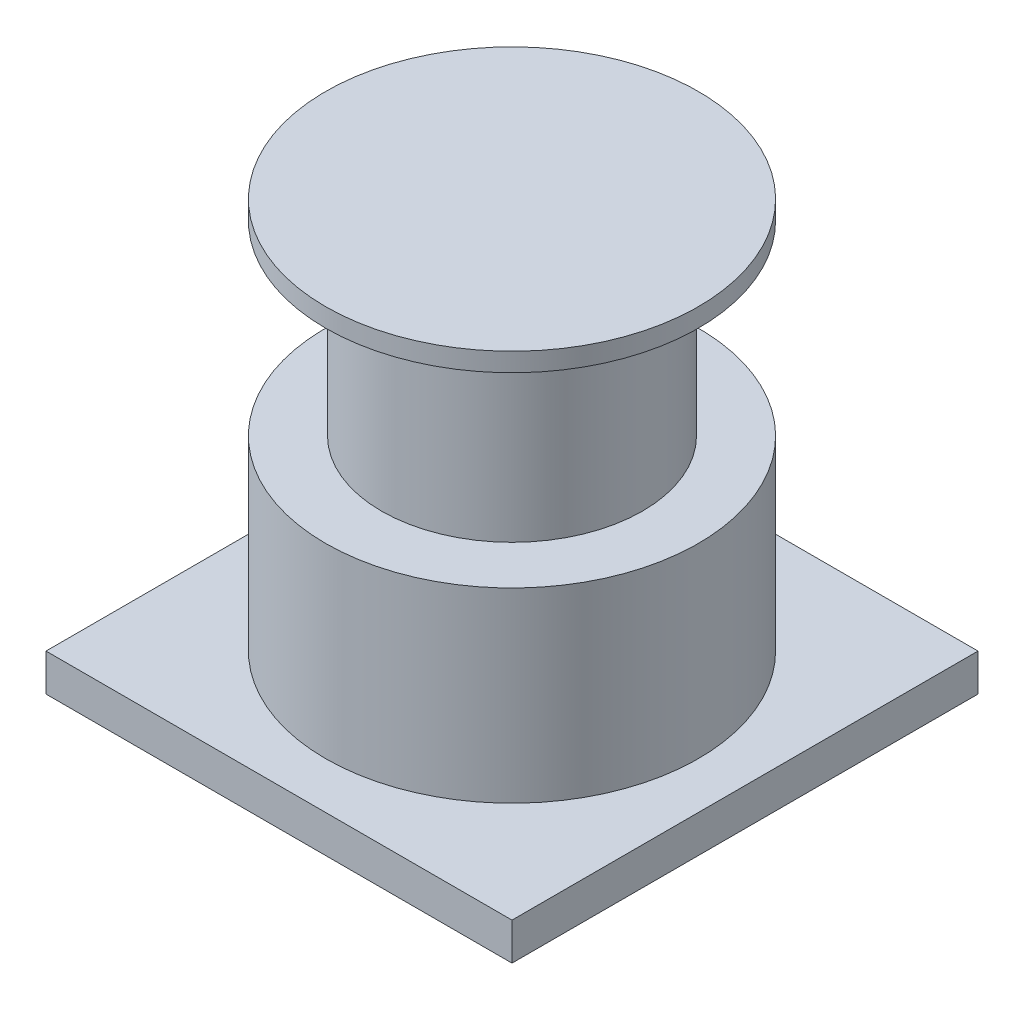
ISO-10303-21;
HEADER;
FILE_DESCRIPTION(('STEP AP214'),'2;1');
FILE_NAME('part.step','',(''),(''),'','','');
FILE_SCHEMA(('AUTOMOTIVE_DESIGN { 1 0 10303 214 1 1 1 1 }'));
ENDSEC;
DATA;
#1=APPLICATION_CONTEXT('core data for automotive mechanical design processes');
#2=APPLICATION_PROTOCOL_DEFINITION('international standard','automotive_design',2000,#1);
#3=PRODUCT_CONTEXT('',#1,'mechanical');
#4=PRODUCT('Part','Part','',(#3));
#5=PRODUCT_RELATED_PRODUCT_CATEGORY('part','',(#4));
#6=PRODUCT_DEFINITION_FORMATION('','',#4);
#7=PRODUCT_DEFINITION_CONTEXT('part definition',#1,'design');
#8=PRODUCT_DEFINITION('design','',#6,#7);
#9=PRODUCT_DEFINITION_SHAPE('','',#8);
#10=(LENGTH_UNIT() NAMED_UNIT(*) SI_UNIT(.MILLI.,.METRE.));
#11=(NAMED_UNIT(*) PLANE_ANGLE_UNIT() SI_UNIT($,.RADIAN.));
#12=(NAMED_UNIT(*) SI_UNIT($,.STERADIAN.) SOLID_ANGLE_UNIT());
#13=UNCERTAINTY_MEASURE_WITH_UNIT(LENGTH_MEASURE(1.E-05),#10,'distance_accuracy_value','');
#14=(GEOMETRIC_REPRESENTATION_CONTEXT(3) GLOBAL_UNCERTAINTY_ASSIGNED_CONTEXT((#13)) GLOBAL_UNIT_ASSIGNED_CONTEXT((#10,
#11,#12)) REPRESENTATION_CONTEXT('',''));
#15=CARTESIAN_POINT('',(0.,0.,0.));
#16=DIRECTION('',(0.,0.,1.));
#17=DIRECTION('',(1.,0.,0.));
#18=AXIS2_PLACEMENT_3D('',#15,#16,#17);
#19=CARTESIAN_POINT('',(-78.1893004115226,20.,163.168724279835));
#20=DIRECTION('',(1.,0.,0.));
#21=DIRECTION('',(0.,0.,-1.));
#22=AXIS2_PLACEMENT_3D('',#19,#20,#21);
#23=PLANE('',#22);
#24=DIRECTION('',(0.,0.,1.));
#25=VECTOR('',#24,1.);
#26=CARTESIAN_POINT('',(-78.1893004115226,0.,163.168724279835));
#27=LINE('',#26,#25);
#28=CARTESIAN_POINT('',(-78.1893004115226,0.,-86.8312757201647));
#29=VERTEX_POINT('',#28);
#30=CARTESIAN_POINT('',(-78.1893004115226,0.,163.168724279835));
#31=VERTEX_POINT('',#30);
#32=EDGE_CURVE('E110',#29,#31,#27,.T.);
#33=ORIENTED_EDGE('',*,*,#32,.T.);
#34=DIRECTION('',(0.,-1.,0.));
#35=VECTOR('',#34,1.);
#36=CARTESIAN_POINT('',(-78.1893004115226,20.,163.168724279835));
#37=LINE('',#36,#35);
#38=CARTESIAN_POINT('',(-78.1893004115226,20.,163.168724279835));
#39=VERTEX_POINT('',#38);
#40=EDGE_CURVE('E46',#39,#31,#37,.T.);
#41=ORIENTED_EDGE('',*,*,#40,.F.);
#42=DIRECTION('',(0.,0.,1.));
#43=VECTOR('',#42,1.);
#44=CARTESIAN_POINT('',(-78.1893004115226,20.,163.168724279835));
#45=LINE('',#44,#43);
#46=CARTESIAN_POINT('',(-78.1893004115226,20.,-86.8312757201647));
#47=VERTEX_POINT('',#46);
#48=EDGE_CURVE('E97',#47,#39,#45,.T.);
#49=ORIENTED_EDGE('',*,*,#48,.F.);
#50=DIRECTION('',(0.,-1.,0.));
#51=VECTOR('',#50,1.);
#52=CARTESIAN_POINT('',(-78.1893004115226,20.,-86.8312757201647));
#53=LINE('',#52,#51);
#54=EDGE_CURVE('E106',#47,#29,#53,.T.);
#55=ORIENTED_EDGE('',*,*,#54,.T.);
#56=EDGE_LOOP('',(#33,#41,#49,#55));
#57=FACE_BOUND('',#56,.T.);
#58=ADVANCED_FACE('F43',(#57),#23,.F.);
#59=CARTESIAN_POINT('',(-78.1893004115226,20.,163.168724279835));
#60=DIRECTION('',(0.,0.,-1.));
#61=DIRECTION('',(-1.,0.,0.));
#62=AXIS2_PLACEMENT_3D('',#59,#60,#61);
#63=PLANE('',#62);
#64=DIRECTION('',(1.,0.,0.));
#65=VECTOR('',#64,1.);
#66=CARTESIAN_POINT('',(-78.1893004115226,0.,163.168724279835));
#67=LINE('',#66,#65);
#68=CARTESIAN_POINT('',(171.810699588477,0.,163.168724279835));
#69=VERTEX_POINT('',#68);
#70=EDGE_CURVE('E102',#31,#69,#67,.T.);
#71=ORIENTED_EDGE('',*,*,#70,.T.);
#72=DIRECTION('',(0.,-1.,0.));
#73=VECTOR('',#72,1.);
#74=CARTESIAN_POINT('',(171.810699588477,20.,163.168724279835));
#75=LINE('',#74,#73);
#76=CARTESIAN_POINT('',(171.810699588477,20.,163.168724279835));
#77=VERTEX_POINT('',#76);
#78=EDGE_CURVE('E100',#77,#69,#75,.T.);
#79=ORIENTED_EDGE('',*,*,#78,.F.);
#80=DIRECTION('',(1.,0.,0.));
#81=VECTOR('',#80,1.);
#82=CARTESIAN_POINT('',(-78.1893004115226,20.,163.168724279835));
#83=LINE('',#82,#81);
#84=EDGE_CURVE('E92',#39,#77,#83,.T.);
#85=ORIENTED_EDGE('',*,*,#84,.F.);
#86=ORIENTED_EDGE('',*,*,#40,.T.);
#87=EDGE_LOOP('',(#71,#79,#85,#86));
#88=FACE_BOUND('',#87,.T.);
#89=ADVANCED_FACE('F101',(#88),#63,.F.);
#90=CARTESIAN_POINT('',(171.810699588477,20.,163.168724279835));
#91=DIRECTION('',(-1.,0.,0.));
#92=DIRECTION('',(0.,0.,1.));
#93=AXIS2_PLACEMENT_3D('',#90,#91,#92);
#94=PLANE('',#93);
#95=DIRECTION('',(0.,0.,-1.));
#96=VECTOR('',#95,1.);
#97=CARTESIAN_POINT('',(171.810699588477,0.,163.168724279835));
#98=LINE('',#97,#96);
#99=CARTESIAN_POINT('',(171.810699588477,0.,-86.8312757201647));
#100=VERTEX_POINT('',#99);
#101=EDGE_CURVE('E78',#69,#100,#98,.T.);
#102=ORIENTED_EDGE('',*,*,#101,.T.);
#103=DIRECTION('',(0.,-1.,0.));
#104=VECTOR('',#103,1.);
#105=CARTESIAN_POINT('',(171.810699588477,20.,-86.8312757201647));
#106=LINE('',#105,#104);
#107=CARTESIAN_POINT('',(171.810699588477,20.,-86.8312757201647));
#108=VERTEX_POINT('',#107);
#109=EDGE_CURVE('E103',#108,#100,#106,.T.);
#110=ORIENTED_EDGE('',*,*,#109,.F.);
#111=DIRECTION('',(0.,0.,-1.));
#112=VECTOR('',#111,1.);
#113=CARTESIAN_POINT('',(171.810699588477,20.,163.168724279835));
#114=LINE('',#113,#112);
#115=EDGE_CURVE('E95',#77,#108,#114,.T.);
#116=ORIENTED_EDGE('',*,*,#115,.F.);
#117=ORIENTED_EDGE('',*,*,#78,.T.);
#118=EDGE_LOOP('',(#102,#110,#116,#117));
#119=FACE_BOUND('',#118,.T.);
#120=ADVANCED_FACE('F104',(#119),#94,.F.);
#121=CARTESIAN_POINT('',(-78.1893004115226,20.,-86.8312757201647));
#122=DIRECTION('',(0.,0.,1.));
#123=DIRECTION('',(1.,0.,0.));
#124=AXIS2_PLACEMENT_3D('',#121,#122,#123);
#125=PLANE('',#124);
#126=DIRECTION('',(-1.,0.,0.));
#127=VECTOR('',#126,1.);
#128=CARTESIAN_POINT('',(-78.1893004115226,0.,-86.8312757201647));
#129=LINE('',#128,#127);
#130=EDGE_CURVE('E84',#100,#29,#129,.T.);
#131=ORIENTED_EDGE('',*,*,#130,.T.);
#132=ORIENTED_EDGE('',*,*,#54,.F.);
#133=DIRECTION('',(-1.,0.,0.));
#134=VECTOR('',#133,1.);
#135=CARTESIAN_POINT('',(-78.1893004115226,20.,-86.8312757201647));
#136=LINE('',#135,#134);
#137=EDGE_CURVE('E61',#108,#47,#136,.T.);
#138=ORIENTED_EDGE('',*,*,#137,.F.);
#139=ORIENTED_EDGE('',*,*,#109,.T.);
#140=EDGE_LOOP('',(#131,#132,#138,#139));
#141=FACE_BOUND('',#140,.T.);
#142=ADVANCED_FACE('F118',(#141),#125,.F.);
#143=CARTESIAN_POINT('',(0.,20.,0.));
#144=DIRECTION('',(0.,-1.,0.));
#145=DIRECTION('',(0.,0.,-1.));
#146=AXIS2_PLACEMENT_3D('',#143,#144,#145);
#147=PLANE('',#146);
#148=CARTESIAN_POINT('',(46.8106995884774,20.,38.1687242798354));
#149=DIRECTION('',(0.,1.,0.));
#150=DIRECTION('',(0.,0.,1.));
#151=AXIS2_PLACEMENT_3D('',#148,#149,#150);
#152=CIRCLE('',#151,100.);
#153=CARTESIAN_POINT('',(46.8106995884774,20.,138.168724279835));
#154=VERTEX_POINT('',#153);
#155=EDGE_CURVE('E52',#154,#154,#152,.T.);
#156=ORIENTED_EDGE('',*,*,#155,.F.);
#157=EDGE_LOOP('',(#156));
#158=FACE_BOUND('',#157,.T.);
#159=ORIENTED_EDGE('',*,*,#48,.T.);
#160=ORIENTED_EDGE('',*,*,#84,.T.);
#161=ORIENTED_EDGE('',*,*,#115,.T.);
#162=ORIENTED_EDGE('',*,*,#137,.T.);
#163=EDGE_LOOP('',(#159,#160,#161,#162));
#164=FACE_BOUND('',#163,.T.);
#165=ADVANCED_FACE('F93',(#158,#164),#147,.F.);
#166=CARTESIAN_POINT('',(0.,0.,0.));
#167=DIRECTION('',(0.,-1.,0.));
#168=DIRECTION('',(0.,0.,-1.));
#169=AXIS2_PLACEMENT_3D('',#166,#167,#168);
#170=PLANE('',#169);
#171=ORIENTED_EDGE('',*,*,#32,.F.);
#172=ORIENTED_EDGE('',*,*,#130,.F.);
#173=ORIENTED_EDGE('',*,*,#101,.F.);
#174=ORIENTED_EDGE('',*,*,#70,.F.);
#175=EDGE_LOOP('',(#171,#172,#173,#174));
#176=FACE_BOUND('',#175,.T.);
#177=ADVANCED_FACE('F121',(#176),#170,.T.);
#178=CARTESIAN_POINT('',(46.8106995884774,120.,38.1687242798354));
#179=DIRECTION('',(0.,-1.,0.));
#180=DIRECTION('',(0.,0.,-1.));
#181=AXIS2_PLACEMENT_3D('',#178,#179,#180);
#182=CYLINDRICAL_SURFACE('',#181,100.);
#183=CARTESIAN_POINT('',(46.8106995884774,120.,38.1687242798354));
#184=DIRECTION('',(0.,1.,0.));
#185=DIRECTION('',(0.,0.,1.));
#186=AXIS2_PLACEMENT_3D('',#183,#184,#185);
#187=CIRCLE('',#186,100.);
#188=CARTESIAN_POINT('',(46.8106995884774,120.,138.168724279835));
#189=VERTEX_POINT('',#188);
#190=EDGE_CURVE('E113',#189,#189,#187,.T.);
#191=ORIENTED_EDGE('',*,*,#190,.F.);
#192=EDGE_LOOP('',(#191));
#193=FACE_BOUND('',#192,.T.);
#194=ORIENTED_EDGE('',*,*,#155,.T.);
#195=EDGE_LOOP('',(#194));
#196=FACE_BOUND('',#195,.T.);
#197=ADVANCED_FACE('F168',(#193,#196),#182,.T.);
#198=CARTESIAN_POINT('',(46.8106995884774,120.,38.1687242798354));
#199=DIRECTION('',(0.,1.,0.));
#200=DIRECTION('',(0.,0.,1.));
#201=AXIS2_PLACEMENT_3D('',#198,#199,#200);
#202=PLANE('',#201);
#203=CARTESIAN_POINT('',(46.8106995884774,120.,38.1687242798354));
#204=DIRECTION('',(0.,1.,0.));
#205=DIRECTION('',(0.,0.,1.));
#206=AXIS2_PLACEMENT_3D('',#203,#204,#205);
#207=CIRCLE('',#206,70.);
#208=CARTESIAN_POINT('',(46.8106995884774,120.,108.168724279835));
#209=VERTEX_POINT('',#208);
#210=EDGE_CURVE('E11',#209,#209,#207,.T.);
#211=ORIENTED_EDGE('',*,*,#210,.F.);
#212=EDGE_LOOP('',(#211));
#213=FACE_BOUND('',#212,.T.);
#214=ORIENTED_EDGE('',*,*,#190,.T.);
#215=EDGE_LOOP('',(#214));
#216=FACE_BOUND('',#215,.T.);
#217=ADVANCED_FACE('F174',(#213,#216),#202,.T.);
#218=CARTESIAN_POINT('',(46.8106995884774,220.,38.1687242798354));
#219=DIRECTION('',(0.,-1.,0.));
#220=DIRECTION('',(0.,0.,-1.));
#221=AXIS2_PLACEMENT_3D('',#218,#219,#220);
#222=CYLINDRICAL_SURFACE('',#221,70.);
#223=CARTESIAN_POINT('',(46.8106995884774,220.,38.1687242798354));
#224=DIRECTION('',(0.,1.,0.));
#225=DIRECTION('',(0.,0.,1.));
#226=AXIS2_PLACEMENT_3D('',#223,#224,#225);
#227=CIRCLE('',#226,70.);
#228=CARTESIAN_POINT('',(46.8106995884774,220.,108.168724279835));
#229=VERTEX_POINT('',#228);
#230=EDGE_CURVE('E127',#229,#229,#227,.T.);
#231=ORIENTED_EDGE('',*,*,#230,.F.);
#232=EDGE_LOOP('',(#231));
#233=FACE_BOUND('',#232,.T.);
#234=ORIENTED_EDGE('',*,*,#210,.T.);
#235=EDGE_LOOP('',(#234));
#236=FACE_BOUND('',#235,.T.);
#237=ADVANCED_FACE('F143',(#233,#236),#222,.T.);
#238=CARTESIAN_POINT('',(46.8106995884774,230.,38.1687242798354));
#239=DIRECTION('',(0.,-1.,0.));
#240=DIRECTION('',(0.,0.,-1.));
#241=AXIS2_PLACEMENT_3D('',#238,#239,#240);
#242=CYLINDRICAL_SURFACE('',#241,100.);
#243=CARTESIAN_POINT('',(46.8106995884774,230.,38.1687242798354));
#244=DIRECTION('',(0.,1.,0.));
#245=DIRECTION('',(0.,0.,1.));
#246=AXIS2_PLACEMENT_3D('',#243,#244,#245);
#247=CIRCLE('',#246,100.);
#248=CARTESIAN_POINT('',(46.8106995884774,230.,138.168724279835));
#249=VERTEX_POINT('',#248);
#250=EDGE_CURVE('E131',#249,#249,#247,.T.);
#251=ORIENTED_EDGE('',*,*,#250,.F.);
#252=EDGE_LOOP('',(#251));
#253=FACE_BOUND('',#252,.T.);
#254=CARTESIAN_POINT('',(46.8106995884774,220.,38.1687242798354));
#255=DIRECTION('',(0.,1.,0.));
#256=DIRECTION('',(0.,0.,1.));
#257=AXIS2_PLACEMENT_3D('',#254,#255,#256);
#258=CIRCLE('',#257,100.);
#259=CARTESIAN_POINT('',(46.8106995884774,220.,138.168724279835));
#260=VERTEX_POINT('',#259);
#261=EDGE_CURVE('E132',#260,#260,#258,.T.);
#262=ORIENTED_EDGE('',*,*,#261,.T.);
#263=EDGE_LOOP('',(#262));
#264=FACE_BOUND('',#263,.T.);
#265=ADVANCED_FACE('F140',(#253,#264),#242,.T.);
#266=CARTESIAN_POINT('',(46.8106995884774,230.,38.1687242798354));
#267=DIRECTION('',(0.,1.,0.));
#268=DIRECTION('',(0.,0.,1.));
#269=AXIS2_PLACEMENT_3D('',#266,#267,#268);
#270=PLANE('',#269);
#271=ORIENTED_EDGE('',*,*,#250,.T.);
#272=EDGE_LOOP('',(#271));
#273=FACE_BOUND('',#272,.T.);
#274=ADVANCED_FACE('F138',(#273),#270,.T.);
#275=CARTESIAN_POINT('',(46.8106995884774,220.,38.1687242798354));
#276=DIRECTION('',(0.,1.,0.));
#277=DIRECTION('',(0.,0.,1.));
#278=AXIS2_PLACEMENT_3D('',#275,#276,#277);
#279=PLANE('',#278);
#280=ORIENTED_EDGE('',*,*,#230,.T.);
#281=EDGE_LOOP('',(#280));
#282=FACE_BOUND('',#281,.T.);
#283=ORIENTED_EDGE('',*,*,#261,.F.);
#284=EDGE_LOOP('',(#283));
#285=FACE_BOUND('',#284,.T.);
#286=ADVANCED_FACE('F147',(#282,#285),#279,.F.);
#287=CLOSED_SHELL('',(#58,#89,#120,#142,#165,#177,#197,#217,#237,#265,#274,#286));
#288=MANIFOLD_SOLID_BREP('B2',#287);
#289=ADVANCED_BREP_SHAPE_REPRESENTATION('',(#18,#288),#14);
#290=SHAPE_DEFINITION_REPRESENTATION(#9,#289);
ENDSEC;
END-ISO-10303-21;
